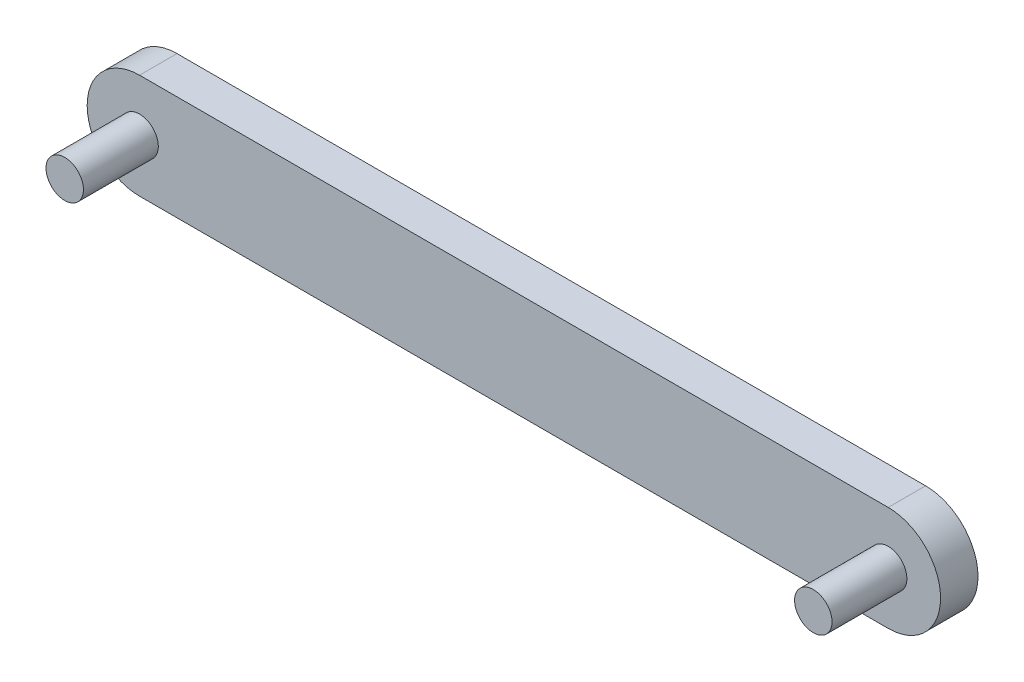
ISO-10303-21;
HEADER;
FILE_DESCRIPTION(('STEP AP214'),'2;1');
FILE_NAME('part.step','',(''),(''),'','','');
FILE_SCHEMA(('AUTOMOTIVE_DESIGN { 1 0 10303 214 1 1 1 1 }'));
ENDSEC;
DATA;
#1=APPLICATION_CONTEXT('core data for automotive mechanical design processes');
#2=APPLICATION_PROTOCOL_DEFINITION('international standard','automotive_design',2000,#1);
#3=PRODUCT_CONTEXT('',#1,'mechanical');
#4=PRODUCT('Part','Part','',(#3));
#5=PRODUCT_RELATED_PRODUCT_CATEGORY('part','',(#4));
#6=PRODUCT_DEFINITION_FORMATION('','',#4);
#7=PRODUCT_DEFINITION_CONTEXT('part definition',#1,'design');
#8=PRODUCT_DEFINITION('design','',#6,#7);
#9=PRODUCT_DEFINITION_SHAPE('','',#8);
#10=(LENGTH_UNIT() NAMED_UNIT(*) SI_UNIT(.MILLI.,.METRE.));
#11=(NAMED_UNIT(*) PLANE_ANGLE_UNIT() SI_UNIT($,.RADIAN.));
#12=(NAMED_UNIT(*) SI_UNIT($,.STERADIAN.) SOLID_ANGLE_UNIT());
#13=UNCERTAINTY_MEASURE_WITH_UNIT(LENGTH_MEASURE(1.E-05),#10,'distance_accuracy_value','');
#14=(GEOMETRIC_REPRESENTATION_CONTEXT(3) GLOBAL_UNCERTAINTY_ASSIGNED_CONTEXT((#13)) GLOBAL_UNIT_ASSIGNED_CONTEXT((#10,
#11,#12)) REPRESENTATION_CONTEXT('',''));
#15=CARTESIAN_POINT('',(0.,0.,0.));
#16=DIRECTION('',(0.,0.,1.));
#17=DIRECTION('',(1.,0.,0.));
#18=AXIS2_PLACEMENT_3D('',#15,#16,#17);
#19=CARTESIAN_POINT('',(50.0000008692215,-1.21691011475769E-07,5.));
#20=DIRECTION('',(0.,0.,-1.));
#21=DIRECTION('',(-1.,0.,0.));
#22=AXIS2_PLACEMENT_3D('',#19,#20,#21);
#23=CYLINDRICAL_SURFACE('',#22,7.);
#24=CARTESIAN_POINT('',(50.0000008692215,-1.21691011475769E-07,0.));
#25=DIRECTION('',(0.,0.,1.));
#26=DIRECTION('',(-1.,0.,0.));
#27=AXIS2_PLACEMENT_3D('',#24,#25,#26);
#28=CIRCLE('',#27,7.);
#29=CARTESIAN_POINT('',(50.0000008692215,-7.00000012169101,0.));
#30=VERTEX_POINT('',#29);
#31=CARTESIAN_POINT('',(50.0000008692215,6.99999987830899,0.));
#32=VERTEX_POINT('',#31);
#33=EDGE_CURVE('E106',#30,#32,#28,.T.);
#34=ORIENTED_EDGE('',*,*,#33,.T.);
#35=DIRECTION('',(0.,0.,-1.));
#36=VECTOR('',#35,1.);
#37=CARTESIAN_POINT('',(50.0000008692215,6.99999987830899,5.));
#38=LINE('',#37,#36);
#39=CARTESIAN_POINT('',(50.0000008692215,6.99999987830899,5.));
#40=VERTEX_POINT('',#39);
#41=EDGE_CURVE('E97',#40,#32,#38,.T.);
#42=ORIENTED_EDGE('',*,*,#41,.F.);
#43=CARTESIAN_POINT('',(50.0000008692215,-1.21691011475769E-07,5.));
#44=DIRECTION('',(0.,0.,1.));
#45=DIRECTION('',(-1.,0.,0.));
#46=AXIS2_PLACEMENT_3D('',#43,#44,#45);
#47=CIRCLE('',#46,7.);
#48=CARTESIAN_POINT('',(50.0000008692215,-7.00000012169101,5.));
#49=VERTEX_POINT('',#48);
#50=EDGE_CURVE('E91',#49,#40,#47,.T.);
#51=ORIENTED_EDGE('',*,*,#50,.F.);
#52=DIRECTION('',(0.,0.,-1.));
#53=VECTOR('',#52,1.);
#54=CARTESIAN_POINT('',(50.0000008692215,-7.00000012169101,5.));
#55=LINE('',#54,#53);
#56=EDGE_CURVE('E102',#49,#30,#55,.T.);
#57=ORIENTED_EDGE('',*,*,#56,.T.);
#58=EDGE_LOOP('',(#34,#42,#51,#57));
#59=FACE_BOUND('',#58,.T.);
#60=ADVANCED_FACE('F39',(#59),#23,.T.);
#61=CARTESIAN_POINT('',(-49.9999991307785,6.999999878309,5.));
#62=DIRECTION('',(0.,-1.,0.));
#63=DIRECTION('',(1.,0.,0.));
#64=AXIS2_PLACEMENT_3D('',#61,#62,#63);
#65=PLANE('',#64);
#66=DIRECTION('',(-1.,0.,0.));
#67=VECTOR('',#66,1.);
#68=CARTESIAN_POINT('',(-49.9999991307785,6.999999878309,0.));
#69=LINE('',#68,#67);
#70=CARTESIAN_POINT('',(-49.9999991307785,6.999999878309,0.));
#71=VERTEX_POINT('',#70);
#72=EDGE_CURVE('E96',#32,#71,#69,.T.);
#73=ORIENTED_EDGE('',*,*,#72,.T.);
#74=DIRECTION('',(0.,0.,-1.));
#75=VECTOR('',#74,1.);
#76=CARTESIAN_POINT('',(-49.9999991307785,6.999999878309,5.));
#77=LINE('',#76,#75);
#78=CARTESIAN_POINT('',(-49.9999991307785,6.999999878309,5.));
#79=VERTEX_POINT('',#78);
#80=EDGE_CURVE('E94',#79,#71,#77,.T.);
#81=ORIENTED_EDGE('',*,*,#80,.F.);
#82=DIRECTION('',(-1.,0.,0.));
#83=VECTOR('',#82,1.);
#84=CARTESIAN_POINT('',(-49.9999991307785,6.999999878309,5.));
#85=LINE('',#84,#83);
#86=EDGE_CURVE('E86',#40,#79,#85,.T.);
#87=ORIENTED_EDGE('',*,*,#86,.F.);
#88=ORIENTED_EDGE('',*,*,#41,.T.);
#89=EDGE_LOOP('',(#73,#81,#87,#88));
#90=FACE_BOUND('',#89,.T.);
#91=ADVANCED_FACE('F95',(#90),#65,.F.);
#92=CARTESIAN_POINT('',(-50.0000008692215,-1.21691005796482E-07,5.));
#93=DIRECTION('',(0.,0.,-1.));
#94=DIRECTION('',(-1.,0.,0.));
#95=AXIS2_PLACEMENT_3D('',#92,#93,#94);
#96=CYLINDRICAL_SURFACE('',#95,7.00000000000022);
#97=CARTESIAN_POINT('',(-50.0000008692215,-1.21691005796482E-07,0.));
#98=DIRECTION('',(0.,0.,1.));
#99=DIRECTION('',(1.,0.,0.));
#100=AXIS2_PLACEMENT_3D('',#97,#98,#99);
#101=CIRCLE('',#100,7.00000000000022);
#102=CARTESIAN_POINT('',(-50.0000026076645,-7.00000012169101,0.));
#103=VERTEX_POINT('',#102);
#104=EDGE_CURVE('E72',#71,#103,#101,.T.);
#105=ORIENTED_EDGE('',*,*,#104,.T.);
#106=DIRECTION('',(0.,0.,-1.));
#107=VECTOR('',#106,1.);
#108=CARTESIAN_POINT('',(-50.0000026076645,-7.00000012169101,5.));
#109=LINE('',#108,#107);
#110=CARTESIAN_POINT('',(-50.0000026076645,-7.00000012169101,5.));
#111=VERTEX_POINT('',#110);
#112=EDGE_CURVE('E98',#111,#103,#109,.T.);
#113=ORIENTED_EDGE('',*,*,#112,.F.);
#114=CARTESIAN_POINT('',(-50.0000008692215,-1.21691005796482E-07,5.));
#115=DIRECTION('',(0.,0.,1.));
#116=DIRECTION('',(1.,0.,0.));
#117=AXIS2_PLACEMENT_3D('',#114,#115,#116);
#118=CIRCLE('',#117,7.00000000000022);
#119=EDGE_CURVE('E89',#79,#111,#118,.T.);
#120=ORIENTED_EDGE('',*,*,#119,.F.);
#121=ORIENTED_EDGE('',*,*,#80,.T.);
#122=EDGE_LOOP('',(#105,#113,#120,#121));
#123=FACE_BOUND('',#122,.T.);
#124=ADVANCED_FACE('F100',(#123),#96,.T.);
#125=CARTESIAN_POINT('',(-50.0000026076645,-7.00000012169101,5.));
#126=DIRECTION('',(0.,1.,0.));
#127=DIRECTION('',(-1.,0.,0.));
#128=AXIS2_PLACEMENT_3D('',#125,#126,#127);
#129=PLANE('',#128);
#130=DIRECTION('',(1.,0.,0.));
#131=VECTOR('',#130,1.);
#132=CARTESIAN_POINT('',(-50.0000026076645,-7.00000012169101,0.));
#133=LINE('',#132,#131);
#134=EDGE_CURVE('E78',#103,#30,#133,.T.);
#135=ORIENTED_EDGE('',*,*,#134,.T.);
#136=ORIENTED_EDGE('',*,*,#56,.F.);
#137=DIRECTION('',(1.,0.,0.));
#138=VECTOR('',#137,1.);
#139=CARTESIAN_POINT('',(-50.0000026076645,-7.00000012169101,5.));
#140=LINE('',#139,#138);
#141=EDGE_CURVE('E55',#111,#49,#140,.T.);
#142=ORIENTED_EDGE('',*,*,#141,.F.);
#143=ORIENTED_EDGE('',*,*,#112,.T.);
#144=EDGE_LOOP('',(#135,#136,#142,#143));
#145=FACE_BOUND('',#144,.T.);
#146=ADVANCED_FACE('F122',(#145),#129,.F.);
#147=CARTESIAN_POINT('',(50.0000008692215,-1.21691011475769E-07,5.));
#148=DIRECTION('',(0.,0.,-1.));
#149=DIRECTION('',(-1.,0.,0.));
#150=AXIS2_PLACEMENT_3D('',#147,#148,#149);
#151=PLANE('',#150);
#152=CARTESIAN_POINT('',(50.0000008692215,-1.21691005796482E-07,5.));
#153=DIRECTION('',(0.,0.,-1.));
#154=DIRECTION('',(-1.,0.,0.));
#155=AXIS2_PLACEMENT_3D('',#152,#153,#154);
#156=CIRCLE('',#155,2.5);
#157=CARTESIAN_POINT('',(47.5000008692215,-1.21691005796482E-07,5.));
#158=VERTEX_POINT('',#157);
#159=EDGE_CURVE('E11',#158,#158,#156,.F.);
#160=ORIENTED_EDGE('',*,*,#159,.F.);
#161=EDGE_LOOP('',(#160));
#162=FACE_BOUND('',#161,.T.);
#163=CARTESIAN_POINT('',(-50.0000008692215,-1.21691005796482E-07,5.));
#164=DIRECTION('',(0.,0.,-1.));
#165=DIRECTION('',(-1.,0.,0.));
#166=AXIS2_PLACEMENT_3D('',#163,#164,#165);
#167=CIRCLE('',#166,2.5);
#168=CARTESIAN_POINT('',(-52.5000008692215,-1.21691005796482E-07,5.));
#169=VERTEX_POINT('',#168);
#170=EDGE_CURVE('E47',#169,#169,#167,.F.);
#171=ORIENTED_EDGE('',*,*,#170,.F.);
#172=EDGE_LOOP('',(#171));
#173=FACE_BOUND('',#172,.T.);
#174=ORIENTED_EDGE('',*,*,#50,.T.);
#175=ORIENTED_EDGE('',*,*,#86,.T.);
#176=ORIENTED_EDGE('',*,*,#119,.T.);
#177=ORIENTED_EDGE('',*,*,#141,.T.);
#178=EDGE_LOOP('',(#174,#175,#176,#177));
#179=FACE_BOUND('',#178,.T.);
#180=ADVANCED_FACE('F87',(#162,#173,#179),#151,.F.);
#181=CARTESIAN_POINT('',(50.0000008692215,-1.21691011475769E-07,0.));
#182=DIRECTION('',(0.,0.,-1.));
#183=DIRECTION('',(-1.,0.,0.));
#184=AXIS2_PLACEMENT_3D('',#181,#182,#183);
#185=PLANE('',#184);
#186=ORIENTED_EDGE('',*,*,#33,.F.);
#187=ORIENTED_EDGE('',*,*,#134,.F.);
#188=ORIENTED_EDGE('',*,*,#104,.F.);
#189=ORIENTED_EDGE('',*,*,#72,.F.);
#190=EDGE_LOOP('',(#186,#187,#188,#189));
#191=FACE_BOUND('',#190,.T.);
#192=ADVANCED_FACE('F121',(#191),#185,.T.);
#193=CARTESIAN_POINT('',(-50.0000008692215,-1.21691005796482E-07,15.));
#194=DIRECTION('',(0.,0.,-1.));
#195=DIRECTION('',(-1.,0.,0.));
#196=AXIS2_PLACEMENT_3D('',#193,#194,#195);
#197=CYLINDRICAL_SURFACE('',#196,2.5);
#198=CARTESIAN_POINT('',(-50.0000008692215,-1.21691005796482E-07,15.));
#199=DIRECTION('',(0.,0.,1.));
#200=DIRECTION('',(1.,0.,0.));
#201=AXIS2_PLACEMENT_3D('',#198,#199,#200);
#202=CIRCLE('',#201,2.5);
#203=CARTESIAN_POINT('',(-47.5000008692215,-1.21691005796482E-07,15.));
#204=VERTEX_POINT('',#203);
#205=EDGE_CURVE('E109',#204,#204,#202,.T.);
#206=ORIENTED_EDGE('',*,*,#205,.F.);
#207=EDGE_LOOP('',(#206));
#208=FACE_BOUND('',#207,.T.);
#209=ORIENTED_EDGE('',*,*,#170,.T.);
#210=EDGE_LOOP('',(#209));
#211=FACE_BOUND('',#210,.T.);
#212=ADVANCED_FACE('F118',(#208,#211),#197,.T.);
#213=CARTESIAN_POINT('',(-50.0000008692215,-1.21691005796482E-07,15.));
#214=DIRECTION('',(0.,0.,1.));
#215=DIRECTION('',(1.,0.,0.));
#216=AXIS2_PLACEMENT_3D('',#213,#214,#215);
#217=PLANE('',#216);
#218=ORIENTED_EDGE('',*,*,#205,.T.);
#219=EDGE_LOOP('',(#218));
#220=FACE_BOUND('',#219,.T.);
#221=ADVANCED_FACE('F152',(#220),#217,.T.);
#222=CARTESIAN_POINT('',(50.0000008692215,-1.21691005796482E-07,15.));
#223=DIRECTION('',(0.,0.,-1.));
#224=DIRECTION('',(-1.,0.,0.));
#225=AXIS2_PLACEMENT_3D('',#222,#223,#224);
#226=CYLINDRICAL_SURFACE('',#225,2.5);
#227=CARTESIAN_POINT('',(50.0000008692215,-1.21691005796482E-07,15.));
#228=DIRECTION('',(0.,0.,1.));
#229=DIRECTION('',(-1.,0.,0.));
#230=AXIS2_PLACEMENT_3D('',#227,#228,#229);
#231=CIRCLE('',#230,2.5);
#232=CARTESIAN_POINT('',(47.5000008692215,-1.21691005796482E-07,15.));
#233=VERTEX_POINT('',#232);
#234=EDGE_CURVE('E143',#233,#233,#231,.T.);
#235=ORIENTED_EDGE('',*,*,#234,.F.);
#236=EDGE_LOOP('',(#235));
#237=FACE_BOUND('',#236,.T.);
#238=ORIENTED_EDGE('',*,*,#159,.T.);
#239=EDGE_LOOP('',(#238));
#240=FACE_BOUND('',#239,.T.);
#241=ADVANCED_FACE('F149',(#237,#240),#226,.T.);
#242=CARTESIAN_POINT('',(50.0000008692215,-1.21691005796482E-07,15.));
#243=DIRECTION('',(0.,0.,-1.));
#244=DIRECTION('',(-1.,0.,0.));
#245=AXIS2_PLACEMENT_3D('',#242,#243,#244);
#246=PLANE('',#245);
#247=ORIENTED_EDGE('',*,*,#234,.T.);
#248=EDGE_LOOP('',(#247));
#249=FACE_BOUND('',#248,.T.);
#250=ADVANCED_FACE('F147',(#249),#246,.F.);
#251=CLOSED_SHELL('',(#60,#91,#124,#146,#180,#192,#212,#221,#241,#250));
#252=MANIFOLD_SOLID_BREP('B2',#251);
#253=ADVANCED_BREP_SHAPE_REPRESENTATION('',(#18,#252),#14);
#254=SHAPE_DEFINITION_REPRESENTATION(#9,#253);
ENDSEC;
END-ISO-10303-21;
